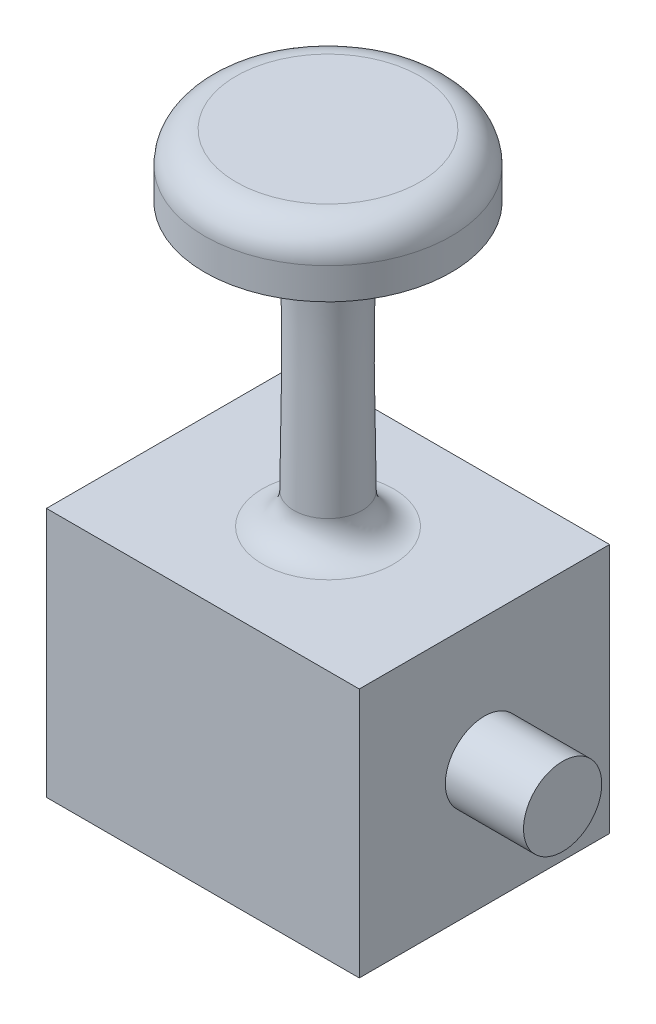
ISO-10303-21;
HEADER;
FILE_DESCRIPTION(('STEP AP214'),'2;1');
FILE_NAME('part.step','',(''),(''),'','','');
FILE_SCHEMA(('AUTOMOTIVE_DESIGN { 1 0 10303 214 1 1 1 1 }'));
ENDSEC;
DATA;
#1=APPLICATION_CONTEXT('core data for automotive mechanical design processes');
#2=APPLICATION_PROTOCOL_DEFINITION('international standard','automotive_design',2000,#1);
#3=PRODUCT_CONTEXT('',#1,'mechanical');
#4=PRODUCT('Part','Part','',(#3));
#5=PRODUCT_RELATED_PRODUCT_CATEGORY('part','',(#4));
#6=PRODUCT_DEFINITION_FORMATION('','',#4);
#7=PRODUCT_DEFINITION_CONTEXT('part definition',#1,'design');
#8=PRODUCT_DEFINITION('design','',#6,#7);
#9=PRODUCT_DEFINITION_SHAPE('','',#8);
#10=(LENGTH_UNIT() NAMED_UNIT(*) SI_UNIT(.MILLI.,.METRE.));
#11=(NAMED_UNIT(*) PLANE_ANGLE_UNIT() SI_UNIT($,.RADIAN.));
#12=(NAMED_UNIT(*) SI_UNIT($,.STERADIAN.) SOLID_ANGLE_UNIT());
#13=UNCERTAINTY_MEASURE_WITH_UNIT(LENGTH_MEASURE(1.E-05),#10,'distance_accuracy_value','');
#14=(GEOMETRIC_REPRESENTATION_CONTEXT(3) GLOBAL_UNCERTAINTY_ASSIGNED_CONTEXT((#13)) GLOBAL_UNIT_ASSIGNED_CONTEXT((#10,
#11,#12)) REPRESENTATION_CONTEXT('',''));
#15=CARTESIAN_POINT('',(0.,0.,0.));
#16=DIRECTION('',(0.,0.,1.));
#17=DIRECTION('',(1.,0.,0.));
#18=AXIS2_PLACEMENT_3D('',#15,#16,#17);
#19=CARTESIAN_POINT('',(25.4,0.,0.));
#20=DIRECTION('',(0.,0.,-1.));
#21=DIRECTION('',(-1.,0.,0.));
#22=AXIS2_PLACEMENT_3D('',#19,#20,#21);
#23=PLANE('',#22);
#24=DIRECTION('',(0.,-1.,0.));
#25=VECTOR('',#24,1.);
#26=CARTESIAN_POINT('',(0.,0.,0.));
#27=LINE('',#26,#25);
#28=CARTESIAN_POINT('',(0.,20.32,0.));
#29=VERTEX_POINT('',#28);
#30=CARTESIAN_POINT('',(0.,0.,0.));
#31=VERTEX_POINT('',#30);
#32=EDGE_CURVE('E101',#29,#31,#27,.T.);
#33=ORIENTED_EDGE('',*,*,#32,.T.);
#34=DIRECTION('',(-1.,0.,0.));
#35=VECTOR('',#34,1.);
#36=CARTESIAN_POINT('',(25.4,0.,0.));
#37=LINE('',#36,#35);
#38=CARTESIAN_POINT('',(25.4,0.,0.));
#39=VERTEX_POINT('',#38);
#40=EDGE_CURVE('E92',#39,#31,#37,.T.);
#41=ORIENTED_EDGE('',*,*,#40,.F.);
#42=DIRECTION('',(0.,-1.,0.));
#43=VECTOR('',#42,1.);
#44=CARTESIAN_POINT('',(25.4,0.,0.));
#45=LINE('',#44,#43);
#46=CARTESIAN_POINT('',(25.4,20.32,0.));
#47=VERTEX_POINT('',#46);
#48=EDGE_CURVE('E86',#47,#39,#45,.T.);
#49=ORIENTED_EDGE('',*,*,#48,.F.);
#50=DIRECTION('',(-1.,0.,0.));
#51=VECTOR('',#50,1.);
#52=CARTESIAN_POINT('',(25.4,20.32,0.));
#53=LINE('',#52,#51);
#54=EDGE_CURVE('E97',#47,#29,#53,.T.);
#55=ORIENTED_EDGE('',*,*,#54,.T.);
#56=EDGE_LOOP('',(#33,#41,#49,#55));
#57=FACE_BOUND('',#56,.T.);
#58=ADVANCED_FACE('F33',(#57),#23,.F.);
#59=CARTESIAN_POINT('',(25.4,0.,0.));
#60=DIRECTION('',(0.,1.,0.));
#61=DIRECTION('',(0.,0.,1.));
#62=AXIS2_PLACEMENT_3D('',#59,#60,#61);
#63=PLANE('',#62);
#64=DIRECTION('',(0.,0.,-1.));
#65=VECTOR('',#64,1.);
#66=CARTESIAN_POINT('',(0.,0.,0.));
#67=LINE('',#66,#65);
#68=CARTESIAN_POINT('',(0.,0.,-20.32));
#69=VERTEX_POINT('',#68);
#70=EDGE_CURVE('E91',#31,#69,#67,.T.);
#71=ORIENTED_EDGE('',*,*,#70,.T.);
#72=DIRECTION('',(-1.,0.,0.));
#73=VECTOR('',#72,1.);
#74=CARTESIAN_POINT('',(25.4,0.,-20.32));
#75=LINE('',#74,#73);
#76=CARTESIAN_POINT('',(25.4,0.,-20.32));
#77=VERTEX_POINT('',#76);
#78=EDGE_CURVE('E89',#77,#69,#75,.T.);
#79=ORIENTED_EDGE('',*,*,#78,.F.);
#80=DIRECTION('',(0.,0.,-1.));
#81=VECTOR('',#80,1.);
#82=CARTESIAN_POINT('',(25.4,0.,0.));
#83=LINE('',#82,#81);
#84=EDGE_CURVE('E81',#39,#77,#83,.T.);
#85=ORIENTED_EDGE('',*,*,#84,.F.);
#86=ORIENTED_EDGE('',*,*,#40,.T.);
#87=EDGE_LOOP('',(#71,#79,#85,#86));
#88=FACE_BOUND('',#87,.T.);
#89=ADVANCED_FACE('F90',(#88),#63,.F.);
#90=CARTESIAN_POINT('',(25.4,0.,-20.32));
#91=DIRECTION('',(0.,0.,1.));
#92=DIRECTION('',(1.,0.,0.));
#93=AXIS2_PLACEMENT_3D('',#90,#91,#92);
#94=PLANE('',#93);
#95=DIRECTION('',(0.,1.,0.));
#96=VECTOR('',#95,1.);
#97=CARTESIAN_POINT('',(0.,0.,-20.32));
#98=LINE('',#97,#96);
#99=CARTESIAN_POINT('',(0.,20.32,-20.32));
#100=VERTEX_POINT('',#99);
#101=EDGE_CURVE('E67',#69,#100,#98,.T.);
#102=ORIENTED_EDGE('',*,*,#101,.T.);
#103=DIRECTION('',(-1.,0.,0.));
#104=VECTOR('',#103,1.);
#105=CARTESIAN_POINT('',(25.4,20.32,-20.32));
#106=LINE('',#105,#104);
#107=CARTESIAN_POINT('',(25.4,20.32,-20.32));
#108=VERTEX_POINT('',#107);
#109=EDGE_CURVE('E93',#108,#100,#106,.T.);
#110=ORIENTED_EDGE('',*,*,#109,.F.);
#111=DIRECTION('',(0.,1.,0.));
#112=VECTOR('',#111,1.);
#113=CARTESIAN_POINT('',(25.4,0.,-20.32));
#114=LINE('',#113,#112);
#115=EDGE_CURVE('E84',#77,#108,#114,.T.);
#116=ORIENTED_EDGE('',*,*,#115,.F.);
#117=ORIENTED_EDGE('',*,*,#78,.T.);
#118=EDGE_LOOP('',(#102,#110,#116,#117));
#119=FACE_BOUND('',#118,.T.);
#120=ADVANCED_FACE('F95',(#119),#94,.F.);
#121=CARTESIAN_POINT('',(25.4,20.32,0.));
#122=DIRECTION('',(0.,-1.,0.));
#123=DIRECTION('',(0.,0.,-1.));
#124=AXIS2_PLACEMENT_3D('',#121,#122,#123);
#125=PLANE('',#124);
#126=CARTESIAN_POINT('',(12.7,20.32,-10.16));
#127=DIRECTION('',(0.,-1.,0.));
#128=DIRECTION('',(0.,0.,-1.));
#129=AXIS2_PLACEMENT_3D('',#126,#127,#128);
#130=CIRCLE('',#129,5.30974622417256);
#131=CARTESIAN_POINT('',(12.7,20.32,-15.4697462241726));
#132=VERTEX_POINT('',#131);
#133=EDGE_CURVE('E114',#132,#132,#130,.T.);
#134=ORIENTED_EDGE('',*,*,#133,.T.);
#135=EDGE_LOOP('',(#134));
#136=FACE_BOUND('',#135,.T.);
#137=DIRECTION('',(0.,0.,1.));
#138=VECTOR('',#137,1.);
#139=CARTESIAN_POINT('',(0.,20.32,0.));
#140=LINE('',#139,#138);
#141=EDGE_CURVE('E73',#100,#29,#140,.T.);
#142=ORIENTED_EDGE('',*,*,#141,.T.);
#143=ORIENTED_EDGE('',*,*,#54,.F.);
#144=DIRECTION('',(0.,0.,1.));
#145=VECTOR('',#144,1.);
#146=CARTESIAN_POINT('',(25.4,20.32,0.));
#147=LINE('',#146,#145);
#148=EDGE_CURVE('E50',#108,#47,#147,.T.);
#149=ORIENTED_EDGE('',*,*,#148,.F.);
#150=ORIENTED_EDGE('',*,*,#109,.T.);
#151=EDGE_LOOP('',(#142,#143,#149,#150));
#152=FACE_BOUND('',#151,.T.);
#153=ADVANCED_FACE('F144',(#136,#152),#125,.F.);
#154=CARTESIAN_POINT('',(25.4,0.,0.));
#155=DIRECTION('',(-1.,0.,0.));
#156=DIRECTION('',(0.,0.,1.));
#157=AXIS2_PLACEMENT_3D('',#154,#155,#156);
#158=PLANE('',#157);
#159=CARTESIAN_POINT('',(25.4,10.16,-10.16));
#160=DIRECTION('',(-1.,0.,0.));
#161=DIRECTION('',(0.,0.,1.));
#162=AXIS2_PLACEMENT_3D('',#159,#160,#161);
#163=CIRCLE('',#162,3.175);
#164=CARTESIAN_POINT('',(25.4,10.16,-6.985));
#165=VERTEX_POINT('',#164);
#166=EDGE_CURVE('E104',#165,#165,#163,.T.);
#167=ORIENTED_EDGE('',*,*,#166,.T.);
#168=EDGE_LOOP('',(#167));
#169=FACE_BOUND('',#168,.T.);
#170=ORIENTED_EDGE('',*,*,#48,.T.);
#171=ORIENTED_EDGE('',*,*,#84,.T.);
#172=ORIENTED_EDGE('',*,*,#115,.T.);
#173=ORIENTED_EDGE('',*,*,#148,.T.);
#174=EDGE_LOOP('',(#170,#171,#172,#173));
#175=FACE_BOUND('',#174,.T.);
#176=ADVANCED_FACE('F82',(#169,#175),#158,.F.);
#177=CARTESIAN_POINT('',(0.,0.,0.));
#178=DIRECTION('',(-1.,0.,0.));
#179=DIRECTION('',(0.,0.,1.));
#180=AXIS2_PLACEMENT_3D('',#177,#178,#179);
#181=PLANE('',#180);
#182=CARTESIAN_POINT('',(0.,10.16,-10.16));
#183=DIRECTION('',(-1.,0.,0.));
#184=DIRECTION('',(0.,0.,1.));
#185=AXIS2_PLACEMENT_3D('',#182,#183,#184);
#186=CIRCLE('',#185,3.175);
#187=CARTESIAN_POINT('',(0.,10.16,-6.985));
#188=VERTEX_POINT('',#187);
#189=EDGE_CURVE('E111',#188,#188,#186,.T.);
#190=ORIENTED_EDGE('',*,*,#189,.F.);
#191=EDGE_LOOP('',(#190));
#192=FACE_BOUND('',#191,.T.);
#193=ORIENTED_EDGE('',*,*,#32,.F.);
#194=ORIENTED_EDGE('',*,*,#141,.F.);
#195=ORIENTED_EDGE('',*,*,#101,.F.);
#196=ORIENTED_EDGE('',*,*,#70,.F.);
#197=EDGE_LOOP('',(#193,#194,#195,#196));
#198=FACE_BOUND('',#197,.T.);
#199=ADVANCED_FACE('F148',(#192,#198),#181,.T.);
#200=CARTESIAN_POINT('',(-6.35,10.16,-10.16));
#201=DIRECTION('',(1.,0.,0.));
#202=DIRECTION('',(0.,0.,-1.));
#203=AXIS2_PLACEMENT_3D('',#200,#201,#202);
#204=PLANE('',#203);
#205=CARTESIAN_POINT('',(-6.35,10.16,-10.16));
#206=DIRECTION('',(1.,0.,0.));
#207=DIRECTION('',(0.,0.,-1.));
#208=AXIS2_PLACEMENT_3D('',#205,#206,#207);
#209=CIRCLE('',#208,3.175);
#210=CARTESIAN_POINT('',(-6.35,10.16,-13.335));
#211=VERTEX_POINT('',#210);
#212=EDGE_CURVE('E190',#211,#211,#209,.T.);
#213=ORIENTED_EDGE('',*,*,#212,.F.);
#214=EDGE_LOOP('',(#213));
#215=FACE_BOUND('',#214,.T.);
#216=ADVANCED_FACE('F151',(#215),#204,.F.);
#217=CARTESIAN_POINT('',(-6.35,10.16,-10.16));
#218=DIRECTION('',(1.,0.,0.));
#219=DIRECTION('',(0.,0.,-1.));
#220=AXIS2_PLACEMENT_3D('',#217,#218,#219);
#221=CYLINDRICAL_SURFACE('',#220,3.175);
#222=ORIENTED_EDGE('',*,*,#189,.T.);
#223=EDGE_LOOP('',(#222));
#224=FACE_BOUND('',#223,.T.);
#225=ORIENTED_EDGE('',*,*,#212,.T.);
#226=EDGE_LOOP('',(#225));
#227=FACE_BOUND('',#226,.T.);
#228=ADVANCED_FACE('F156',(#224,#227),#221,.T.);
#229=CARTESIAN_POINT('',(31.75,10.16,-10.16));
#230=DIRECTION('',(1.,0.,0.));
#231=DIRECTION('',(0.,0.,-1.));
#232=AXIS2_PLACEMENT_3D('',#229,#230,#231);
#233=CIRCLE('',#232,3.175);
#234=CARTESIAN_POINT('',(31.75,10.16,-13.335));
#235=VERTEX_POINT('',#234);
#236=EDGE_CURVE('E187',#235,#235,#233,.T.);
#237=ORIENTED_EDGE('',*,*,#236,.F.);
#238=EDGE_LOOP('',(#237));
#239=FACE_BOUND('',#238,.T.);
#240=ORIENTED_EDGE('',*,*,#166,.F.);
#241=EDGE_LOOP('',(#240));
#242=FACE_BOUND('',#241,.T.);
#243=ADVANCED_FACE('F159',(#239,#242),#221,.T.);
#244=CARTESIAN_POINT('',(31.75,10.16,-10.16));
#245=DIRECTION('',(1.,0.,0.));
#246=DIRECTION('',(0.,0.,-1.));
#247=AXIS2_PLACEMENT_3D('',#244,#245,#246);
#248=PLANE('',#247);
#249=ORIENTED_EDGE('',*,*,#236,.T.);
#250=EDGE_LOOP('',(#249));
#251=FACE_BOUND('',#250,.T.);
#252=ADVANCED_FACE('F164',(#251),#248,.T.);
#253=CARTESIAN_POINT('',(12.7,48.26,-10.16));
#254=DIRECTION('',(0.,1.,0.));
#255=DIRECTION('',(0.,0.,1.));
#256=AXIS2_PLACEMENT_3D('',#253,#254,#255);
#257=PLANE('',#256);
#258=CARTESIAN_POINT('',(12.7,48.26,-10.16));
#259=DIRECTION('',(0.,1.,0.));
#260=DIRECTION('',(0.,0.,1.));
#261=AXIS2_PLACEMENT_3D('',#258,#259,#260);
#262=CIRCLE('',#261,7.45993783001567);
#263=CARTESIAN_POINT('',(12.7,48.26,-2.70006216998433));
#264=VERTEX_POINT('',#263);
#265=EDGE_CURVE('E11',#264,#264,#262,.T.);
#266=ORIENTED_EDGE('',*,*,#265,.T.);
#267=EDGE_LOOP('',(#266));
#268=FACE_BOUND('',#267,.T.);
#269=ADVANCED_FACE('F167',(#268),#257,.T.);
#270=CARTESIAN_POINT('',(12.7,20.32,-10.16));
#271=DIRECTION('',(0.,-1.,0.));
#272=DIRECTION('',(0.,0.,-1.));
#273=AXIS2_PLACEMENT_3D('',#270,#271,#272);
#274=CYLINDRICAL_SURFACE('',#273,9.99993783001567);
#275=CARTESIAN_POINT('',(12.7,45.72,-10.16));
#276=DIRECTION('',(0.,1.,0.));
#277=DIRECTION('',(0.,0.,1.));
#278=AXIS2_PLACEMENT_3D('',#275,#276,#277);
#279=CIRCLE('',#278,9.99993783001567);
#280=CARTESIAN_POINT('',(12.7,45.72,-0.160062169984328));
#281=VERTEX_POINT('',#280);
#282=EDGE_CURVE('E42',#281,#281,#279,.F.);
#283=ORIENTED_EDGE('',*,*,#282,.T.);
#284=EDGE_LOOP('',(#283));
#285=FACE_BOUND('',#284,.T.);
#286=CARTESIAN_POINT('',(12.7,43.18,-10.16));
#287=DIRECTION('',(0.,-1.,0.));
#288=DIRECTION('',(0.,0.,-1.));
#289=AXIS2_PLACEMENT_3D('',#286,#287,#288);
#290=CIRCLE('',#289,9.99993783001567);
#291=CARTESIAN_POINT('',(12.7,43.18,-20.1599378300157));
#292=VERTEX_POINT('',#291);
#293=EDGE_CURVE('E181',#292,#292,#290,.T.);
#294=ORIENTED_EDGE('',*,*,#293,.F.);
#295=EDGE_LOOP('',(#294));
#296=FACE_BOUND('',#295,.T.);
#297=ADVANCED_FACE('F122',(#285,#296),#274,.T.);
#298=CARTESIAN_POINT('',(15.494,20.32,-10.16));
#299=CARTESIAN_POINT('',(15.3891370784252,36.9357959931318,-10.16));
#300=CARTESIAN_POINT('',(14.0116502761718,53.9879139133056,-10.16));
#301=CARTESIAN_POINT('',(22.6999378300157,43.18,-10.16));
#302=B_SPLINE_CURVE_WITH_KNOTS('',3,(#298,#299,#300,#301),.UNSPECIFIED.,.F.,.F.,(4,4),(0.,1.),.UNSPECIFIED.);
#303=CARTESIAN_POINT('',(12.7,20.32,-10.16));
#304=DIRECTION('',(0.,-1.,0.));
#305=AXIS1_PLACEMENT('',#303,#304);
#306=SURFACE_OF_REVOLUTION('',#302,#305);
#307=CARTESIAN_POINT('',(12.7,22.8287271874813,-10.16));
#308=DIRECTION('',(0.,-1.,0.));
#309=DIRECTION('',(0.,0.,-1.));
#310=AXIS2_PLACEMENT_3D('',#307,#308,#309);
#311=CIRCLE('',#310,2.76993874894984);
#312=CARTESIAN_POINT('',(12.7,22.8287271874813,-12.9299387489498));
#313=VERTEX_POINT('',#312);
#314=EDGE_CURVE('E117',#313,#313,#311,.F.);
#315=ORIENTED_EDGE('',*,*,#314,.T.);
#316=EDGE_LOOP('',(#315));
#317=FACE_BOUND('',#316,.T.);
#318=ORIENTED_EDGE('',*,*,#293,.T.);
#319=EDGE_LOOP('',(#318));
#320=FACE_BOUND('',#319,.T.);
#321=ADVANCED_FACE('F131',(#317,#320),#306,.F.);
#322=CARTESIAN_POINT('',(12.7,22.86,-10.16));
#323=DIRECTION('',(0.,-1.,0.));
#324=DIRECTION('',(0.,0.,-1.));
#325=AXIS2_PLACEMENT_3D('',#322,#323,#324);
#326=TOROIDAL_SURFACE('',#325,5.30974622417256,2.54);
#327=ORIENTED_EDGE('',*,*,#314,.F.);
#328=EDGE_LOOP('',(#327));
#329=FACE_BOUND('',#328,.T.);
#330=ORIENTED_EDGE('',*,*,#133,.F.);
#331=EDGE_LOOP('',(#330));
#332=FACE_BOUND('',#331,.T.);
#333=ADVANCED_FACE('F126',(#329,#332),#326,.F.);
#334=CARTESIAN_POINT('',(12.7,45.72,-10.16));
#335=DIRECTION('',(0.,1.,0.));
#336=DIRECTION('',(0.,0.,1.));
#337=AXIS2_PLACEMENT_3D('',#334,#335,#336);
#338=TOROIDAL_SURFACE('',#337,7.45993783001567,2.54);
#339=ORIENTED_EDGE('',*,*,#265,.F.);
#340=EDGE_LOOP('',(#339));
#341=FACE_BOUND('',#340,.T.);
#342=ORIENTED_EDGE('',*,*,#282,.F.);
#343=EDGE_LOOP('',(#342));
#344=FACE_BOUND('',#343,.T.);
#345=ADVANCED_FACE('F35',(#341,#344),#338,.T.);
#346=CLOSED_SHELL('',(#58,#89,#120,#153,#176,#199,#216,#228,#243,#252,#269,#297,#321,#333,#345));
#347=MANIFOLD_SOLID_BREP('B2',#346);
#348=ADVANCED_BREP_SHAPE_REPRESENTATION('',(#18,#347),#14);
#349=SHAPE_DEFINITION_REPRESENTATION(#9,#348);
ENDSEC;
END-ISO-10303-21;
